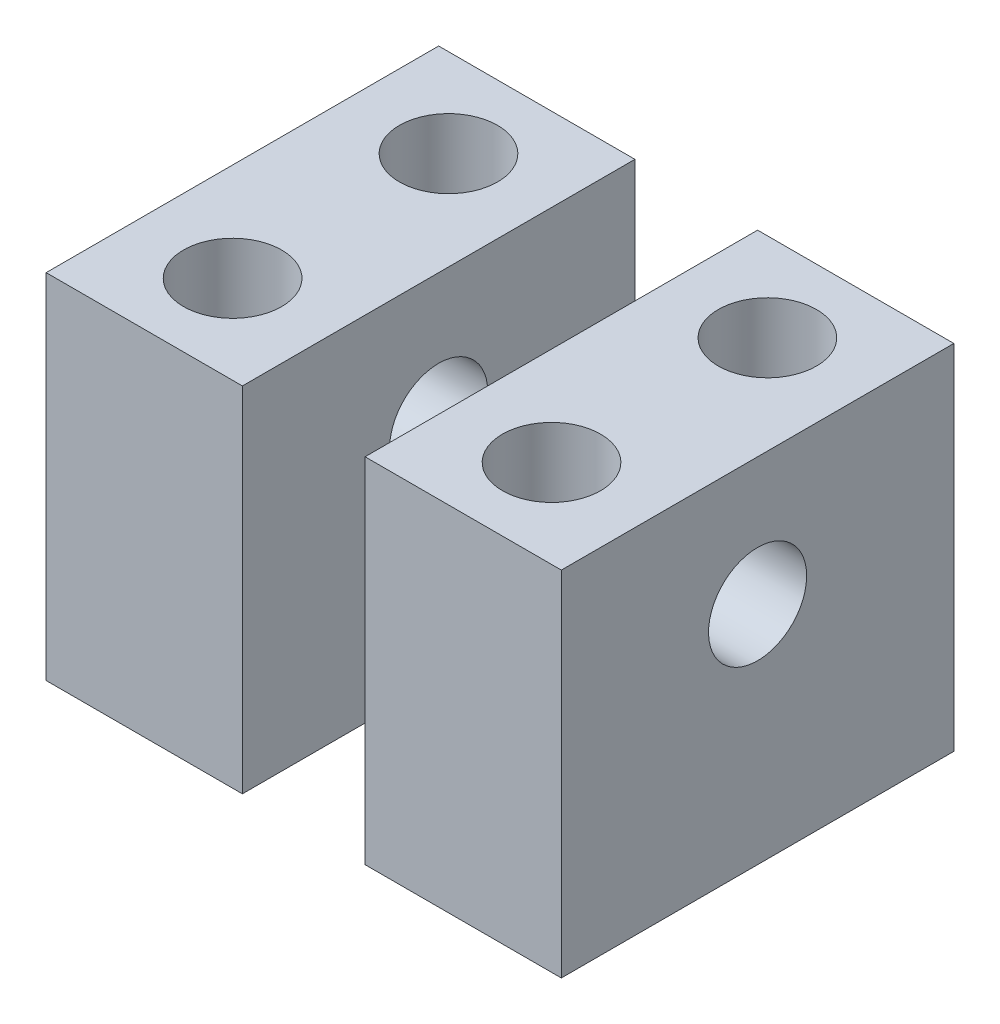
ISO-10303-21;
HEADER;
FILE_DESCRIPTION(('STEP AP214'),'2;1');
FILE_NAME('part.step','',(''),(''),'','','');
FILE_SCHEMA(('AUTOMOTIVE_DESIGN { 1 0 10303 214 1 1 1 1 }'));
ENDSEC;
DATA;
#1=APPLICATION_CONTEXT('core data for automotive mechanical design processes');
#2=APPLICATION_PROTOCOL_DEFINITION('international standard','automotive_design',2000,#1);
#3=PRODUCT_CONTEXT('',#1,'mechanical');
#4=PRODUCT('Part','Part','',(#3));
#5=PRODUCT_RELATED_PRODUCT_CATEGORY('part','',(#4));
#6=PRODUCT_DEFINITION_FORMATION('','',#4);
#7=PRODUCT_DEFINITION_CONTEXT('part definition',#1,'design');
#8=PRODUCT_DEFINITION('design','',#6,#7);
#9=PRODUCT_DEFINITION_SHAPE('','',#8);
#10=(LENGTH_UNIT() NAMED_UNIT(*) SI_UNIT(.MILLI.,.METRE.));
#11=(NAMED_UNIT(*) PLANE_ANGLE_UNIT() SI_UNIT($,.RADIAN.));
#12=(NAMED_UNIT(*) SI_UNIT($,.STERADIAN.) SOLID_ANGLE_UNIT());
#13=UNCERTAINTY_MEASURE_WITH_UNIT(LENGTH_MEASURE(1.E-05),#10,'distance_accuracy_value','');
#14=(GEOMETRIC_REPRESENTATION_CONTEXT(3) GLOBAL_UNCERTAINTY_ASSIGNED_CONTEXT((#13)) GLOBAL_UNIT_ASSIGNED_CONTEXT((#10,
#11,#12)) REPRESENTATION_CONTEXT('',''));
#15=CARTESIAN_POINT('',(0.,0.,0.));
#16=DIRECTION('',(0.,0.,1.));
#17=DIRECTION('',(1.,0.,0.));
#18=AXIS2_PLACEMENT_3D('',#15,#16,#17);
#19=CARTESIAN_POINT('',(26.25,0.,20.));
#20=DIRECTION('',(0.,1.,0.));
#21=DIRECTION('',(0.,0.,1.));
#22=AXIS2_PLACEMENT_3D('',#19,#20,#21);
#23=PLANE('',#22);
#24=CARTESIAN_POINT('',(21.25,0.,15.5));
#25=DIRECTION('',(0.,1.,0.));
#26=DIRECTION('',(-1.,0.,0.));
#27=AXIS2_PLACEMENT_3D('',#24,#25,#26);
#28=CIRCLE('',#27,2.5);
#29=CARTESIAN_POINT('',(18.75,0.,15.5));
#30=VERTEX_POINT('',#29);
#31=EDGE_CURVE('E122',#30,#30,#28,.T.);
#32=ORIENTED_EDGE('',*,*,#31,.T.);
#33=EDGE_LOOP('',(#32));
#34=FACE_BOUND('',#33,.T.);
#35=CARTESIAN_POINT('',(21.25,0.,4.5));
#36=DIRECTION('',(0.,1.,0.));
#37=DIRECTION('',(1.,0.,0.));
#38=AXIS2_PLACEMENT_3D('',#35,#36,#37);
#39=CIRCLE('',#38,2.5);
#40=CARTESIAN_POINT('',(23.75,0.,4.5));
#41=VERTEX_POINT('',#40);
#42=EDGE_CURVE('E125',#41,#41,#39,.T.);
#43=ORIENTED_EDGE('',*,*,#42,.T.);
#44=EDGE_LOOP('',(#43));
#45=FACE_BOUND('',#44,.T.);
#46=DIRECTION('',(1.,0.,0.));
#47=VECTOR('',#46,1.);
#48=CARTESIAN_POINT('',(26.25,0.,20.));
#49=LINE('',#48,#47);
#50=CARTESIAN_POINT('',(16.25,0.,20.));
#51=VERTEX_POINT('',#50);
#52=CARTESIAN_POINT('',(26.25,0.,20.));
#53=VERTEX_POINT('',#52);
#54=EDGE_CURVE('E118',#51,#53,#49,.T.);
#55=ORIENTED_EDGE('',*,*,#54,.F.);
#56=DIRECTION('',(0.,0.,-1.));
#57=VECTOR('',#56,1.);
#58=CARTESIAN_POINT('',(16.25,0.,20.));
#59=LINE('',#58,#57);
#60=CARTESIAN_POINT('',(16.25,0.,0.));
#61=VERTEX_POINT('',#60);
#62=EDGE_CURVE('E128',#51,#61,#59,.T.);
#63=ORIENTED_EDGE('',*,*,#62,.T.);
#64=DIRECTION('',(1.,0.,0.));
#65=VECTOR('',#64,1.);
#66=CARTESIAN_POINT('',(26.25,0.,0.));
#67=LINE('',#66,#65);
#68=CARTESIAN_POINT('',(26.25,0.,0.));
#69=VERTEX_POINT('',#68);
#70=EDGE_CURVE('E49',#61,#69,#67,.T.);
#71=ORIENTED_EDGE('',*,*,#70,.T.);
#72=DIRECTION('',(0.,0.,-1.));
#73=VECTOR('',#72,1.);
#74=CARTESIAN_POINT('',(26.25,0.,20.));
#75=LINE('',#74,#73);
#76=EDGE_CURVE('E103',#53,#69,#75,.T.);
#77=ORIENTED_EDGE('',*,*,#76,.F.);
#78=EDGE_LOOP('',(#55,#63,#71,#77));
#79=FACE_BOUND('',#78,.T.);
#80=ADVANCED_FACE('F46',(#34,#45,#79),#23,.F.);
#81=CARTESIAN_POINT('',(0.,0.,20.));
#82=DIRECTION('',(0.,0.,-1.));
#83=DIRECTION('',(-1.,0.,0.));
#84=AXIS2_PLACEMENT_3D('',#81,#82,#83);
#85=PLANE('',#84);
#86=DIRECTION('',(0.,-1.,0.));
#87=VECTOR('',#86,1.);
#88=CARTESIAN_POINT('',(16.25,3.,20.));
#89=LINE('',#88,#87);
#90=CARTESIAN_POINT('',(16.25,18.,20.));
#91=VERTEX_POINT('',#90);
#92=EDGE_CURVE('E62',#91,#51,#89,.T.);
#93=ORIENTED_EDGE('',*,*,#92,.T.);
#94=ORIENTED_EDGE('',*,*,#54,.T.);
#95=DIRECTION('',(0.,1.,0.));
#96=VECTOR('',#95,1.);
#97=CARTESIAN_POINT('',(26.25,18.,20.));
#98=LINE('',#97,#96);
#99=CARTESIAN_POINT('',(26.25,18.,20.));
#100=VERTEX_POINT('',#99);
#101=EDGE_CURVE('E120',#53,#100,#98,.T.);
#102=ORIENTED_EDGE('',*,*,#101,.T.);
#103=DIRECTION('',(-1.,0.,0.));
#104=VECTOR('',#103,1.);
#105=CARTESIAN_POINT('',(16.25,18.,20.));
#106=LINE('',#105,#104);
#107=EDGE_CURVE('E93',#100,#91,#106,.T.);
#108=ORIENTED_EDGE('',*,*,#107,.T.);
#109=EDGE_LOOP('',(#93,#94,#102,#108));
#110=FACE_BOUND('',#109,.T.);
#111=ADVANCED_FACE('F133',(#110),#85,.F.);
#112=CARTESIAN_POINT('',(0.,0.,0.));
#113=DIRECTION('',(0.,0.,-1.));
#114=DIRECTION('',(-1.,0.,0.));
#115=AXIS2_PLACEMENT_3D('',#112,#113,#114);
#116=PLANE('',#115);
#117=DIRECTION('',(0.,1.,0.));
#118=VECTOR('',#117,1.);
#119=CARTESIAN_POINT('',(16.25,0.,0.));
#120=LINE('',#119,#118);
#121=CARTESIAN_POINT('',(16.25,18.,0.));
#122=VERTEX_POINT('',#121);
#123=EDGE_CURVE('E84',#61,#122,#120,.T.);
#124=ORIENTED_EDGE('',*,*,#123,.T.);
#125=DIRECTION('',(-1.,0.,0.));
#126=VECTOR('',#125,1.);
#127=CARTESIAN_POINT('',(16.25,18.,0.));
#128=LINE('',#127,#126);
#129=CARTESIAN_POINT('',(26.25,18.,0.));
#130=VERTEX_POINT('',#129);
#131=EDGE_CURVE('E88',#130,#122,#128,.T.);
#132=ORIENTED_EDGE('',*,*,#131,.F.);
#133=DIRECTION('',(0.,1.,0.));
#134=VECTOR('',#133,1.);
#135=CARTESIAN_POINT('',(26.25,18.,0.));
#136=LINE('',#135,#134);
#137=EDGE_CURVE('E92',#69,#130,#136,.T.);
#138=ORIENTED_EDGE('',*,*,#137,.F.);
#139=ORIENTED_EDGE('',*,*,#70,.F.);
#140=EDGE_LOOP('',(#124,#132,#138,#139));
#141=FACE_BOUND('',#140,.T.);
#142=ADVANCED_FACE('F86',(#141),#116,.T.);
#143=CARTESIAN_POINT('',(26.25,18.,20.));
#144=DIRECTION('',(-1.,0.,0.));
#145=DIRECTION('',(0.,0.,1.));
#146=AXIS2_PLACEMENT_3D('',#143,#144,#145);
#147=PLANE('',#146);
#148=CARTESIAN_POINT('',(26.25,11.5,10.));
#149=DIRECTION('',(1.,0.,0.));
#150=DIRECTION('',(0.,1.,0.));
#151=AXIS2_PLACEMENT_3D('',#148,#149,#150);
#152=CIRCLE('',#151,2.5);
#153=CARTESIAN_POINT('',(26.25,14.,10.));
#154=VERTEX_POINT('',#153);
#155=EDGE_CURVE('E12',#154,#154,#152,.T.);
#156=ORIENTED_EDGE('',*,*,#155,.F.);
#157=EDGE_LOOP('',(#156));
#158=FACE_BOUND('',#157,.T.);
#159=ORIENTED_EDGE('',*,*,#137,.T.);
#160=DIRECTION('',(0.,0.,-1.));
#161=VECTOR('',#160,1.);
#162=CARTESIAN_POINT('',(26.25,18.,20.));
#163=LINE('',#162,#161);
#164=EDGE_CURVE('E102',#100,#130,#163,.T.);
#165=ORIENTED_EDGE('',*,*,#164,.F.);
#166=ORIENTED_EDGE('',*,*,#101,.F.);
#167=ORIENTED_EDGE('',*,*,#76,.T.);
#168=EDGE_LOOP('',(#159,#165,#166,#167));
#169=FACE_BOUND('',#168,.T.);
#170=ADVANCED_FACE('F138',(#158,#169),#147,.F.);
#171=CARTESIAN_POINT('',(16.25,18.,20.));
#172=DIRECTION('',(0.,-1.,0.));
#173=DIRECTION('',(0.,0.,-1.));
#174=AXIS2_PLACEMENT_3D('',#171,#172,#173);
#175=PLANE('',#174);
#176=CARTESIAN_POINT('',(21.25,18.,4.5));
#177=DIRECTION('',(0.,1.,0.));
#178=DIRECTION('',(1.,0.,0.));
#179=AXIS2_PLACEMENT_3D('',#176,#177,#178);
#180=CIRCLE('',#179,2.5);
#181=CARTESIAN_POINT('',(23.75,18.,4.5));
#182=VERTEX_POINT('',#181);
#183=EDGE_CURVE('E55',#182,#182,#180,.T.);
#184=ORIENTED_EDGE('',*,*,#183,.F.);
#185=EDGE_LOOP('',(#184));
#186=FACE_BOUND('',#185,.T.);
#187=CARTESIAN_POINT('',(21.25,18.,15.5));
#188=DIRECTION('',(0.,1.,0.));
#189=DIRECTION('',(-1.,0.,0.));
#190=AXIS2_PLACEMENT_3D('',#187,#188,#189);
#191=CIRCLE('',#190,2.5);
#192=CARTESIAN_POINT('',(18.75,18.,15.5));
#193=VERTEX_POINT('',#192);
#194=EDGE_CURVE('E106',#193,#193,#191,.T.);
#195=ORIENTED_EDGE('',*,*,#194,.F.);
#196=EDGE_LOOP('',(#195));
#197=FACE_BOUND('',#196,.T.);
#198=ORIENTED_EDGE('',*,*,#131,.T.);
#199=DIRECTION('',(0.,0.,-1.));
#200=VECTOR('',#199,1.);
#201=CARTESIAN_POINT('',(16.25,18.,20.));
#202=LINE('',#201,#200);
#203=EDGE_CURVE('E100',#91,#122,#202,.T.);
#204=ORIENTED_EDGE('',*,*,#203,.F.);
#205=ORIENTED_EDGE('',*,*,#107,.F.);
#206=ORIENTED_EDGE('',*,*,#164,.T.);
#207=EDGE_LOOP('',(#198,#204,#205,#206));
#208=FACE_BOUND('',#207,.T.);
#209=ADVANCED_FACE('F98',(#186,#197,#208),#175,.F.);
#210=CARTESIAN_POINT('',(16.25,3.,20.));
#211=DIRECTION('',(1.,0.,0.));
#212=DIRECTION('',(0.,0.,-1.));
#213=AXIS2_PLACEMENT_3D('',#210,#211,#212);
#214=PLANE('',#213);
#215=CARTESIAN_POINT('',(16.25,11.5,10.));
#216=DIRECTION('',(1.,0.,0.));
#217=DIRECTION('',(0.,0.,-1.));
#218=AXIS2_PLACEMENT_3D('',#215,#216,#217);
#219=CIRCLE('',#218,2.5);
#220=CARTESIAN_POINT('',(16.25,11.5,7.5));
#221=VERTEX_POINT('',#220);
#222=EDGE_CURVE('E107',#221,#221,#219,.T.);
#223=ORIENTED_EDGE('',*,*,#222,.T.);
#224=EDGE_LOOP('',(#223));
#225=FACE_BOUND('',#224,.T.);
#226=ORIENTED_EDGE('',*,*,#203,.T.);
#227=ORIENTED_EDGE('',*,*,#123,.F.);
#228=ORIENTED_EDGE('',*,*,#62,.F.);
#229=ORIENTED_EDGE('',*,*,#92,.F.);
#230=EDGE_LOOP('',(#226,#227,#228,#229));
#231=FACE_BOUND('',#230,.T.);
#232=ADVANCED_FACE('F105',(#225,#231),#214,.F.);
#233=CARTESIAN_POINT('',(21.25,0.,15.5));
#234=DIRECTION('',(0.,1.,0.));
#235=DIRECTION('',(-1.,0.,0.));
#236=AXIS2_PLACEMENT_3D('',#233,#234,#235);
#237=CYLINDRICAL_SURFACE('',#236,2.5);
#238=ORIENTED_EDGE('',*,*,#31,.F.);
#239=EDGE_LOOP('',(#238));
#240=FACE_BOUND('',#239,.T.);
#241=ORIENTED_EDGE('',*,*,#194,.T.);
#242=EDGE_LOOP('',(#241));
#243=FACE_BOUND('',#242,.T.);
#244=ADVANCED_FACE('F153',(#240,#243),#237,.F.);
#245=CARTESIAN_POINT('',(21.25,0.,4.5));
#246=DIRECTION('',(0.,1.,0.));
#247=DIRECTION('',(-1.,0.,0.));
#248=AXIS2_PLACEMENT_3D('',#245,#246,#247);
#249=CYLINDRICAL_SURFACE('',#248,2.5);
#250=ORIENTED_EDGE('',*,*,#42,.F.);
#251=EDGE_LOOP('',(#250));
#252=FACE_BOUND('',#251,.T.);
#253=ORIENTED_EDGE('',*,*,#183,.T.);
#254=EDGE_LOOP('',(#253));
#255=FACE_BOUND('',#254,.T.);
#256=ADVANCED_FACE('F149',(#252,#255),#249,.F.);
#257=CARTESIAN_POINT('',(0.,11.5,10.));
#258=DIRECTION('',(1.,0.,0.));
#259=DIRECTION('',(0.,1.,0.));
#260=AXIS2_PLACEMENT_3D('',#257,#258,#259);
#261=CYLINDRICAL_SURFACE('',#260,2.5);
#262=ORIENTED_EDGE('',*,*,#155,.T.);
#263=EDGE_LOOP('',(#262));
#264=FACE_BOUND('',#263,.T.);
#265=ORIENTED_EDGE('',*,*,#222,.F.);
#266=EDGE_LOOP('',(#265));
#267=FACE_BOUND('',#266,.T.);
#268=ADVANCED_FACE('F152',(#264,#267),#261,.F.);
#269=CLOSED_SHELL('',(#80,#111,#142,#170,#209,#232,#244,#256,#268));
#270=MANIFOLD_SOLID_BREP('B2',#269);
#271=CARTESIAN_POINT('',(5.00000000000001,0.,4.5));
#272=DIRECTION('',(0.,1.,0.));
#273=DIRECTION('',(-1.,0.,0.));
#274=AXIS2_PLACEMENT_3D('',#271,#272,#273);
#275=CYLINDRICAL_SURFACE('',#274,2.5);
#276=CARTESIAN_POINT('',(5.00000000000001,0.,4.5));
#277=DIRECTION('',(0.,1.,0.));
#278=DIRECTION('',(-1.,0.,0.));
#279=AXIS2_PLACEMENT_3D('',#276,#277,#278);
#280=CIRCLE('',#279,2.5);
#281=CARTESIAN_POINT('',(2.50000000000001,0.,4.5));
#282=VERTEX_POINT('',#281);
#283=EDGE_CURVE('E376',#282,#282,#280,.T.);
#284=ORIENTED_EDGE('',*,*,#283,.F.);
#285=EDGE_LOOP('',(#284));
#286=FACE_BOUND('',#285,.T.);
#287=CARTESIAN_POINT('',(5.00000000000001,18.,4.5));
#288=DIRECTION('',(0.,1.,0.));
#289=DIRECTION('',(-1.,0.,0.));
#290=AXIS2_PLACEMENT_3D('',#287,#288,#289);
#291=CIRCLE('',#290,2.5);
#292=CARTESIAN_POINT('',(2.50000000000001,18.,4.5));
#293=VERTEX_POINT('',#292);
#294=EDGE_CURVE('E379',#293,#293,#291,.T.);
#295=ORIENTED_EDGE('',*,*,#294,.T.);
#296=EDGE_LOOP('',(#295));
#297=FACE_BOUND('',#296,.T.);
#298=ADVANCED_FACE('F254',(#286,#297),#275,.F.);
#299=CARTESIAN_POINT('',(5.00000000000001,0.,15.5));
#300=DIRECTION('',(0.,1.,0.));
#301=DIRECTION('',(-1.,0.,0.));
#302=AXIS2_PLACEMENT_3D('',#299,#300,#301);
#303=CYLINDRICAL_SURFACE('',#302,2.5);
#304=CARTESIAN_POINT('',(5.00000000000001,0.,15.5));
#305=DIRECTION('',(0.,1.,0.));
#306=DIRECTION('',(1.,0.,0.));
#307=AXIS2_PLACEMENT_3D('',#304,#305,#306);
#308=CIRCLE('',#307,2.5);
#309=CARTESIAN_POINT('',(7.50000000000001,0.,15.5));
#310=VERTEX_POINT('',#309);
#311=EDGE_CURVE('E320',#310,#310,#308,.T.);
#312=ORIENTED_EDGE('',*,*,#311,.F.);
#313=EDGE_LOOP('',(#312));
#314=FACE_BOUND('',#313,.T.);
#315=CARTESIAN_POINT('',(5.00000000000002,18.,15.5));
#316=DIRECTION('',(0.,1.,0.));
#317=DIRECTION('',(1.,0.,0.));
#318=AXIS2_PLACEMENT_3D('',#315,#316,#317);
#319=CIRCLE('',#318,2.5);
#320=CARTESIAN_POINT('',(7.50000000000002,18.,15.5));
#321=VERTEX_POINT('',#320);
#322=EDGE_CURVE('E327',#321,#321,#319,.T.);
#323=ORIENTED_EDGE('',*,*,#322,.T.);
#324=EDGE_LOOP('',(#323));
#325=FACE_BOUND('',#324,.T.);
#326=ADVANCED_FACE('F345',(#314,#325),#303,.F.);
#327=CARTESIAN_POINT('',(0.,11.5,10.));
#328=DIRECTION('',(1.,0.,0.));
#329=DIRECTION('',(0.,1.,0.));
#330=AXIS2_PLACEMENT_3D('',#327,#328,#329);
#331=CYLINDRICAL_SURFACE('',#330,2.5);
#332=CARTESIAN_POINT('',(0.,11.5,10.));
#333=DIRECTION('',(1.,0.,0.));
#334=DIRECTION('',(0.,1.,0.));
#335=AXIS2_PLACEMENT_3D('',#332,#333,#334);
#336=CIRCLE('',#335,2.5);
#337=CARTESIAN_POINT('',(0.,14.,10.));
#338=VERTEX_POINT('',#337);
#339=EDGE_CURVE('E313',#338,#338,#336,.T.);
#340=ORIENTED_EDGE('',*,*,#339,.F.);
#341=EDGE_LOOP('',(#340));
#342=FACE_BOUND('',#341,.T.);
#343=CARTESIAN_POINT('',(10.,11.5,10.));
#344=DIRECTION('',(-1.,0.,0.));
#345=DIRECTION('',(0.,-1.,0.));
#346=AXIS2_PLACEMENT_3D('',#343,#344,#345);
#347=CIRCLE('',#346,2.5);
#348=CARTESIAN_POINT('',(10.,9.,10.));
#349=VERTEX_POINT('',#348);
#350=EDGE_CURVE('E374',#349,#349,#347,.T.);
#351=ORIENTED_EDGE('',*,*,#350,.F.);
#352=EDGE_LOOP('',(#351));
#353=FACE_BOUND('',#352,.T.);
#354=ADVANCED_FACE('F336',(#342,#353),#331,.F.);
#355=CARTESIAN_POINT('',(0.,18.,20.));
#356=DIRECTION('',(0.,-1.,0.));
#357=DIRECTION('',(1.,0.,0.));
#358=AXIS2_PLACEMENT_3D('',#355,#356,#357);
#359=PLANE('',#358);
#360=ORIENTED_EDGE('',*,*,#322,.F.);
#361=EDGE_LOOP('',(#360));
#362=FACE_BOUND('',#361,.T.);
#363=ORIENTED_EDGE('',*,*,#294,.F.);
#364=EDGE_LOOP('',(#363));
#365=FACE_BOUND('',#364,.T.);
#366=DIRECTION('',(-1.,0.,0.));
#367=VECTOR('',#366,1.);
#368=CARTESIAN_POINT('',(0.,18.,0.));
#369=LINE('',#368,#367);
#370=CARTESIAN_POINT('',(10.,18.,0.));
#371=VERTEX_POINT('',#370);
#372=CARTESIAN_POINT('',(0.,18.,0.));
#373=VERTEX_POINT('',#372);
#374=EDGE_CURVE('E317',#371,#373,#369,.T.);
#375=ORIENTED_EDGE('',*,*,#374,.T.);
#376=DIRECTION('',(0.,0.,-1.));
#377=VECTOR('',#376,1.);
#378=CARTESIAN_POINT('',(0.,18.,20.));
#379=LINE('',#378,#377);
#380=CARTESIAN_POINT('',(0.,18.,20.));
#381=VERTEX_POINT('',#380);
#382=EDGE_CURVE('E262',#381,#373,#379,.T.);
#383=ORIENTED_EDGE('',*,*,#382,.F.);
#384=DIRECTION('',(-1.,0.,0.));
#385=VECTOR('',#384,1.);
#386=CARTESIAN_POINT('',(0.,18.,20.));
#387=LINE('',#386,#385);
#388=CARTESIAN_POINT('',(10.,18.,20.));
#389=VERTEX_POINT('',#388);
#390=EDGE_CURVE('E307',#389,#381,#387,.T.);
#391=ORIENTED_EDGE('',*,*,#390,.F.);
#392=DIRECTION('',(0.,0.,-1.));
#393=VECTOR('',#392,1.);
#394=CARTESIAN_POINT('',(10.,18.,20.));
#395=LINE('',#394,#393);
#396=EDGE_CURVE('E44',#389,#371,#395,.T.);
#397=ORIENTED_EDGE('',*,*,#396,.T.);
#398=EDGE_LOOP('',(#375,#383,#391,#397));
#399=FACE_BOUND('',#398,.T.);
#400=ADVANCED_FACE('F334',(#362,#365,#399),#359,.F.);
#401=CARTESIAN_POINT('',(0.,0.,20.));
#402=DIRECTION('',(1.,0.,0.));
#403=DIRECTION('',(0.,0.,-1.));
#404=AXIS2_PLACEMENT_3D('',#401,#402,#403);
#405=PLANE('',#404);
#406=ORIENTED_EDGE('',*,*,#339,.T.);
#407=EDGE_LOOP('',(#406));
#408=FACE_BOUND('',#407,.T.);
#409=DIRECTION('',(0.,-1.,0.));
#410=VECTOR('',#409,1.);
#411=CARTESIAN_POINT('',(0.,0.,0.));
#412=LINE('',#411,#410);
#413=CARTESIAN_POINT('',(0.,0.,0.));
#414=VERTEX_POINT('',#413);
#415=EDGE_CURVE('E294',#373,#414,#412,.T.);
#416=ORIENTED_EDGE('',*,*,#415,.T.);
#417=DIRECTION('',(0.,0.,-1.));
#418=VECTOR('',#417,1.);
#419=CARTESIAN_POINT('',(0.,0.,20.));
#420=LINE('',#419,#418);
#421=CARTESIAN_POINT('',(0.,0.,20.));
#422=VERTEX_POINT('',#421);
#423=EDGE_CURVE('E325',#422,#414,#420,.T.);
#424=ORIENTED_EDGE('',*,*,#423,.F.);
#425=DIRECTION('',(0.,-1.,0.));
#426=VECTOR('',#425,1.);
#427=CARTESIAN_POINT('',(0.,0.,20.));
#428=LINE('',#427,#426);
#429=EDGE_CURVE('E278',#381,#422,#428,.T.);
#430=ORIENTED_EDGE('',*,*,#429,.F.);
#431=ORIENTED_EDGE('',*,*,#382,.T.);
#432=EDGE_LOOP('',(#416,#424,#430,#431));
#433=FACE_BOUND('',#432,.T.);
#434=ADVANCED_FACE('F331',(#408,#433),#405,.F.);
#435=CARTESIAN_POINT('',(0.,0.,20.));
#436=DIRECTION('',(0.,0.,-1.));
#437=DIRECTION('',(-1.,0.,0.));
#438=AXIS2_PLACEMENT_3D('',#435,#436,#437);
#439=PLANE('',#438);
#440=DIRECTION('',(1.,0.,0.));
#441=VECTOR('',#440,1.);
#442=CARTESIAN_POINT('',(26.25,0.,20.));
#443=LINE('',#442,#441);
#444=CARTESIAN_POINT('',(10.,0.,20.));
#445=VERTEX_POINT('',#444);
#446=EDGE_CURVE('E308',#422,#445,#443,.T.);
#447=ORIENTED_EDGE('',*,*,#446,.T.);
#448=DIRECTION('',(0.,1.,0.));
#449=VECTOR('',#448,1.);
#450=CARTESIAN_POINT('',(10.,18.,20.));
#451=LINE('',#450,#449);
#452=EDGE_CURVE('E298',#445,#389,#451,.T.);
#453=ORIENTED_EDGE('',*,*,#452,.T.);
#454=ORIENTED_EDGE('',*,*,#390,.T.);
#455=ORIENTED_EDGE('',*,*,#429,.T.);
#456=EDGE_LOOP('',(#447,#453,#454,#455));
#457=FACE_BOUND('',#456,.T.);
#458=ADVANCED_FACE('F315',(#457),#439,.F.);
#459=CARTESIAN_POINT('',(0.,0.,0.));
#460=DIRECTION('',(0.,0.,-1.));
#461=DIRECTION('',(-1.,0.,0.));
#462=AXIS2_PLACEMENT_3D('',#459,#460,#461);
#463=PLANE('',#462);
#464=DIRECTION('',(0.,1.,0.));
#465=VECTOR('',#464,1.);
#466=CARTESIAN_POINT('',(10.,18.,0.));
#467=LINE('',#466,#465);
#468=CARTESIAN_POINT('',(10.,0.,0.));
#469=VERTEX_POINT('',#468);
#470=EDGE_CURVE('E269',#469,#371,#467,.T.);
#471=ORIENTED_EDGE('',*,*,#470,.F.);
#472=DIRECTION('',(1.,0.,0.));
#473=VECTOR('',#472,1.);
#474=CARTESIAN_POINT('',(26.25,0.,0.));
#475=LINE('',#474,#473);
#476=EDGE_CURVE('E312',#414,#469,#475,.T.);
#477=ORIENTED_EDGE('',*,*,#476,.F.);
#478=ORIENTED_EDGE('',*,*,#415,.F.);
#479=ORIENTED_EDGE('',*,*,#374,.F.);
#480=EDGE_LOOP('',(#471,#477,#478,#479));
#481=FACE_BOUND('',#480,.T.);
#482=ADVANCED_FACE('F333',(#481),#463,.T.);
#483=CARTESIAN_POINT('',(10.,18.,20.));
#484=DIRECTION('',(-1.,0.,0.));
#485=DIRECTION('',(0.,-1.,0.));
#486=AXIS2_PLACEMENT_3D('',#483,#484,#485);
#487=PLANE('',#486);
#488=ORIENTED_EDGE('',*,*,#350,.T.);
#489=EDGE_LOOP('',(#488));
#490=FACE_BOUND('',#489,.T.);
#491=ORIENTED_EDGE('',*,*,#470,.T.);
#492=ORIENTED_EDGE('',*,*,#396,.F.);
#493=ORIENTED_EDGE('',*,*,#452,.F.);
#494=DIRECTION('',(0.,0.,1.));
#495=VECTOR('',#494,1.);
#496=CARTESIAN_POINT('',(10.,0.,0.));
#497=LINE('',#496,#495);
#498=EDGE_CURVE('E304',#469,#445,#497,.T.);
#499=ORIENTED_EDGE('',*,*,#498,.F.);
#500=EDGE_LOOP('',(#491,#492,#493,#499));
#501=FACE_BOUND('',#500,.T.);
#502=ADVANCED_FACE('F303',(#490,#501),#487,.F.);
#503=CARTESIAN_POINT('',(26.25,0.,20.));
#504=DIRECTION('',(0.,1.,0.));
#505=DIRECTION('',(0.,0.,1.));
#506=AXIS2_PLACEMENT_3D('',#503,#504,#505);
#507=PLANE('',#506);
#508=ORIENTED_EDGE('',*,*,#311,.T.);
#509=EDGE_LOOP('',(#508));
#510=FACE_BOUND('',#509,.T.);
#511=ORIENTED_EDGE('',*,*,#283,.T.);
#512=EDGE_LOOP('',(#511));
#513=FACE_BOUND('',#512,.T.);
#514=ORIENTED_EDGE('',*,*,#476,.T.);
#515=ORIENTED_EDGE('',*,*,#498,.T.);
#516=ORIENTED_EDGE('',*,*,#446,.F.);
#517=ORIENTED_EDGE('',*,*,#423,.T.);
#518=EDGE_LOOP('',(#514,#515,#516,#517));
#519=FACE_BOUND('',#518,.T.);
#520=ADVANCED_FACE('F256',(#510,#513,#519),#507,.F.);
#521=CLOSED_SHELL('',(#298,#326,#354,#400,#434,#458,#482,#502,#520));
#522=MANIFOLD_SOLID_BREP('B6',#521);
#523=ADVANCED_BREP_SHAPE_REPRESENTATION('',(#18,#270,#522),#14);
#524=SHAPE_DEFINITION_REPRESENTATION(#9,#523);
ENDSEC;
END-ISO-10303-21;
